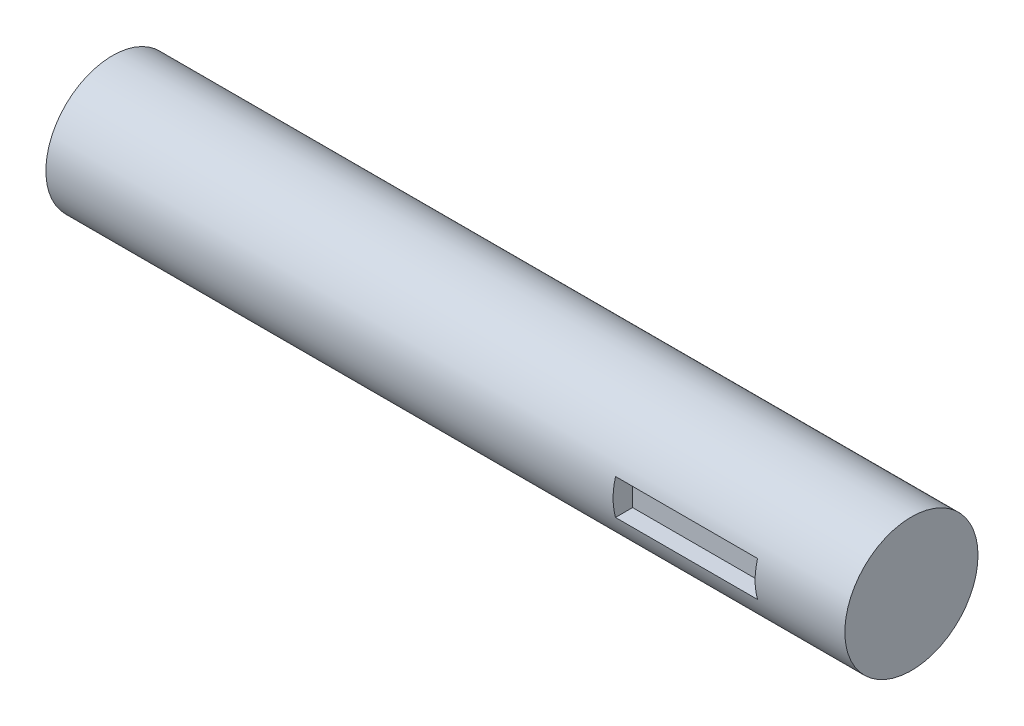
ISO-10303-21;
HEADER;
FILE_DESCRIPTION(('STEP AP214'),'2;1');
FILE_NAME('part.step','',(''),(''),'','','');
FILE_SCHEMA(('AUTOMOTIVE_DESIGN { 1 0 10303 214 1 1 1 1 }'));
ENDSEC;
DATA;
#1=APPLICATION_CONTEXT('core data for automotive mechanical design processes');
#2=APPLICATION_PROTOCOL_DEFINITION('international standard','automotive_design',2000,#1);
#3=PRODUCT_CONTEXT('',#1,'mechanical');
#4=PRODUCT('Part','Part','',(#3));
#5=PRODUCT_RELATED_PRODUCT_CATEGORY('part','',(#4));
#6=PRODUCT_DEFINITION_FORMATION('','',#4);
#7=PRODUCT_DEFINITION_CONTEXT('part definition',#1,'design');
#8=PRODUCT_DEFINITION('design','',#6,#7);
#9=PRODUCT_DEFINITION_SHAPE('','',#8);
#10=(LENGTH_UNIT() NAMED_UNIT(*) SI_UNIT(.MILLI.,.METRE.));
#11=(NAMED_UNIT(*) PLANE_ANGLE_UNIT() SI_UNIT($,.RADIAN.));
#12=(NAMED_UNIT(*) SI_UNIT($,.STERADIAN.) SOLID_ANGLE_UNIT());
#13=UNCERTAINTY_MEASURE_WITH_UNIT(LENGTH_MEASURE(1.E-05),#10,'distance_accuracy_value','');
#14=(GEOMETRIC_REPRESENTATION_CONTEXT(3) GLOBAL_UNCERTAINTY_ASSIGNED_CONTEXT((#13)) GLOBAL_UNIT_ASSIGNED_CONTEXT((#10,
#11,#12)) REPRESENTATION_CONTEXT('',''));
#15=CARTESIAN_POINT('',(0.,0.,0.));
#16=DIRECTION('',(0.,0.,1.));
#17=DIRECTION('',(1.,0.,0.));
#18=AXIS2_PLACEMENT_3D('',#15,#16,#17);
#19=CARTESIAN_POINT('',(0.,0.,0.));
#20=DIRECTION('',(-1.,0.,0.));
#21=DIRECTION('',(0.,0.,1.));
#22=AXIS2_PLACEMENT_3D('',#19,#20,#21);
#23=PLANE('',#22);
#24=CARTESIAN_POINT('',(0.,0.,0.));
#25=DIRECTION('',(1.,0.,0.));
#26=DIRECTION('',(0.,0.,-1.));
#27=AXIS2_PLACEMENT_3D('',#24,#25,#26);
#28=CIRCLE('',#27,15.);
#29=CARTESIAN_POINT('',(0.,0.,-15.));
#30=VERTEX_POINT('',#29);
#31=EDGE_CURVE('E106',#30,#30,#28,.T.);
#32=ORIENTED_EDGE('',*,*,#31,.F.);
#33=EDGE_LOOP('',(#32));
#34=FACE_BOUND('',#33,.T.);
#35=ADVANCED_FACE('F35',(#34),#23,.T.);
#36=CARTESIAN_POINT('',(0.,0.,0.));
#37=DIRECTION('',(1.,0.,0.));
#38=DIRECTION('',(0.,0.,-1.));
#39=AXIS2_PLACEMENT_3D('',#36,#37,#38);
#40=CYLINDRICAL_SURFACE('',#39,15.);
#41=CARTESIAN_POINT('',(159.78639181162,0.,0.));
#42=DIRECTION('',(1.,0.,0.));
#43=DIRECTION('',(0.,0.,-1.));
#44=AXIS2_PLACEMENT_3D('',#41,#42,#43);
#45=CIRCLE('',#44,15.);
#46=CARTESIAN_POINT('',(159.78639181162,-4.,14.456832294801));
#47=VERTEX_POINT('',#46);
#48=CARTESIAN_POINT('',(159.78639181162,4.,14.456832294801));
#49=VERTEX_POINT('',#48);
#50=EDGE_CURVE('E57',#47,#49,#45,.F.);
#51=ORIENTED_EDGE('',*,*,#50,.F.);
#52=DIRECTION('',(1.,0.,0.));
#53=VECTOR('',#52,1.);
#54=CARTESIAN_POINT('',(0.,-4.00000000000002,14.456832294801));
#55=LINE('',#54,#53);
#56=CARTESIAN_POINT('',(127.78639181162,-4.,14.456832294801));
#57=VERTEX_POINT('',#56);
#58=EDGE_CURVE('E11',#57,#47,#55,.T.);
#59=ORIENTED_EDGE('',*,*,#58,.F.);
#60=CARTESIAN_POINT('',(127.78639181162,0.,0.));
#61=DIRECTION('',(-1.,0.,0.));
#62=DIRECTION('',(0.,0.,1.));
#63=AXIS2_PLACEMENT_3D('',#60,#61,#62);
#64=CIRCLE('',#63,15.);
#65=CARTESIAN_POINT('',(127.78639181162,4.,14.456832294801));
#66=VERTEX_POINT('',#65);
#67=EDGE_CURVE('E109',#66,#57,#64,.F.);
#68=ORIENTED_EDGE('',*,*,#67,.F.);
#69=DIRECTION('',(1.,0.,0.));
#70=VECTOR('',#69,1.);
#71=CARTESIAN_POINT('',(0.,3.99999999999999,14.456832294801));
#72=LINE('',#71,#70);
#73=EDGE_CURVE('E42',#49,#66,#72,.F.);
#74=ORIENTED_EDGE('',*,*,#73,.F.);
#75=EDGE_LOOP('',(#51,#59,#68,#74));
#76=FACE_BOUND('',#75,.T.);
#77=ORIENTED_EDGE('',*,*,#31,.T.);
#78=EDGE_LOOP('',(#77));
#79=FACE_BOUND('',#78,.T.);
#80=CARTESIAN_POINT('',(180.,0.,0.));
#81=DIRECTION('',(1.,0.,0.));
#82=DIRECTION('',(0.,0.,-1.));
#83=AXIS2_PLACEMENT_3D('',#80,#81,#82);
#84=CIRCLE('',#83,15.);
#85=CARTESIAN_POINT('',(180.,0.,-15.));
#86=VERTEX_POINT('',#85);
#87=EDGE_CURVE('E100',#86,#86,#84,.T.);
#88=ORIENTED_EDGE('',*,*,#87,.F.);
#89=EDGE_LOOP('',(#88));
#90=FACE_BOUND('',#89,.T.);
#91=ADVANCED_FACE('F115',(#76,#79,#90),#40,.T.);
#92=CARTESIAN_POINT('',(180.,0.,0.));
#93=DIRECTION('',(1.,0.,0.));
#94=DIRECTION('',(0.,0.,-1.));
#95=AXIS2_PLACEMENT_3D('',#92,#93,#94);
#96=PLANE('',#95);
#97=ORIENTED_EDGE('',*,*,#87,.T.);
#98=EDGE_LOOP('',(#97));
#99=FACE_BOUND('',#98,.T.);
#100=ADVANCED_FACE('F118',(#99),#96,.T.);
#101=CARTESIAN_POINT('',(159.78639181162,4.,10.6));
#102=DIRECTION('',(0.,1.,0.));
#103=DIRECTION('',(-1.,0.,0.));
#104=AXIS2_PLACEMENT_3D('',#101,#102,#103);
#105=PLANE('',#104);
#106=ORIENTED_EDGE('',*,*,#73,.T.);
#107=DIRECTION('',(0.,0.,1.));
#108=VECTOR('',#107,1.);
#109=CARTESIAN_POINT('',(127.78639181162,4.,10.6));
#110=LINE('',#109,#108);
#111=CARTESIAN_POINT('',(127.78639181162,4.,10.6));
#112=VERTEX_POINT('',#111);
#113=EDGE_CURVE('E49',#112,#66,#110,.T.);
#114=ORIENTED_EDGE('',*,*,#113,.F.);
#115=DIRECTION('',(-1.,0.,0.));
#116=VECTOR('',#115,1.);
#117=CARTESIAN_POINT('',(159.78639181162,4.,10.6));
#118=LINE('',#117,#116);
#119=CARTESIAN_POINT('',(159.78639181162,4.,10.6));
#120=VERTEX_POINT('',#119);
#121=EDGE_CURVE('E76',#120,#112,#118,.T.);
#122=ORIENTED_EDGE('',*,*,#121,.F.);
#123=DIRECTION('',(0.,0.,1.));
#124=VECTOR('',#123,1.);
#125=CARTESIAN_POINT('',(159.78639181162,4.,10.6));
#126=LINE('',#125,#124);
#127=EDGE_CURVE('E98',#120,#49,#126,.T.);
#128=ORIENTED_EDGE('',*,*,#127,.T.);
#129=EDGE_LOOP('',(#106,#114,#122,#128));
#130=FACE_BOUND('',#129,.T.);
#131=ADVANCED_FACE('F74',(#130),#105,.F.);
#132=CARTESIAN_POINT('',(159.78639181162,-4.,10.6));
#133=DIRECTION('',(1.,0.,0.));
#134=DIRECTION('',(0.,0.,-1.));
#135=AXIS2_PLACEMENT_3D('',#132,#133,#134);
#136=PLANE('',#135);
#137=DIRECTION('',(0.,0.,1.));
#138=VECTOR('',#137,1.);
#139=CARTESIAN_POINT('',(159.78639181162,-4.,10.6));
#140=LINE('',#139,#138);
#141=CARTESIAN_POINT('',(159.78639181162,-4.,10.6));
#142=VERTEX_POINT('',#141);
#143=EDGE_CURVE('E101',#142,#47,#140,.T.);
#144=ORIENTED_EDGE('',*,*,#143,.T.);
#145=ORIENTED_EDGE('',*,*,#50,.T.);
#146=ORIENTED_EDGE('',*,*,#127,.F.);
#147=DIRECTION('',(0.,1.,0.));
#148=VECTOR('',#147,1.);
#149=CARTESIAN_POINT('',(159.78639181162,-4.,10.6));
#150=LINE('',#149,#148);
#151=EDGE_CURVE('E81',#142,#120,#150,.T.);
#152=ORIENTED_EDGE('',*,*,#151,.F.);
#153=EDGE_LOOP('',(#144,#145,#146,#152));
#154=FACE_BOUND('',#153,.T.);
#155=ADVANCED_FACE('F129',(#154),#136,.F.);
#156=CARTESIAN_POINT('',(159.78639181162,-4.,10.6));
#157=DIRECTION('',(0.,-1.,0.));
#158=DIRECTION('',(1.,0.,0.));
#159=AXIS2_PLACEMENT_3D('',#156,#157,#158);
#160=PLANE('',#159);
#161=ORIENTED_EDGE('',*,*,#58,.T.);
#162=ORIENTED_EDGE('',*,*,#143,.F.);
#163=DIRECTION('',(1.,0.,0.));
#164=VECTOR('',#163,1.);
#165=CARTESIAN_POINT('',(159.78639181162,-4.,10.6));
#166=LINE('',#165,#164);
#167=CARTESIAN_POINT('',(127.78639181162,-4.,10.6));
#168=VERTEX_POINT('',#167);
#169=EDGE_CURVE('E90',#168,#142,#166,.T.);
#170=ORIENTED_EDGE('',*,*,#169,.F.);
#171=DIRECTION('',(0.,0.,1.));
#172=VECTOR('',#171,1.);
#173=CARTESIAN_POINT('',(127.78639181162,-4.,10.6));
#174=LINE('',#173,#172);
#175=EDGE_CURVE('E80',#168,#57,#174,.T.);
#176=ORIENTED_EDGE('',*,*,#175,.T.);
#177=EDGE_LOOP('',(#161,#162,#170,#176));
#178=FACE_BOUND('',#177,.T.);
#179=ADVANCED_FACE('F114',(#178),#160,.F.);
#180=CARTESIAN_POINT('',(127.78639181162,4.,10.6));
#181=DIRECTION('',(-1.,0.,0.));
#182=DIRECTION('',(0.,0.,1.));
#183=AXIS2_PLACEMENT_3D('',#180,#181,#182);
#184=PLANE('',#183);
#185=ORIENTED_EDGE('',*,*,#67,.T.);
#186=ORIENTED_EDGE('',*,*,#175,.F.);
#187=DIRECTION('',(0.,-1.,0.));
#188=VECTOR('',#187,1.);
#189=CARTESIAN_POINT('',(127.78639181162,4.,10.6));
#190=LINE('',#189,#188);
#191=EDGE_CURVE('E84',#112,#168,#190,.T.);
#192=ORIENTED_EDGE('',*,*,#191,.F.);
#193=ORIENTED_EDGE('',*,*,#113,.T.);
#194=EDGE_LOOP('',(#185,#186,#192,#193));
#195=FACE_BOUND('',#194,.T.);
#196=ADVANCED_FACE('F85',(#195),#184,.F.);
#197=CARTESIAN_POINT('',(0.,0.,10.6));
#198=DIRECTION('',(0.,0.,1.));
#199=DIRECTION('',(1.,0.,0.));
#200=AXIS2_PLACEMENT_3D('',#197,#198,#199);
#201=PLANE('',#200);
#202=ORIENTED_EDGE('',*,*,#121,.T.);
#203=ORIENTED_EDGE('',*,*,#191,.T.);
#204=ORIENTED_EDGE('',*,*,#169,.T.);
#205=ORIENTED_EDGE('',*,*,#151,.T.);
#206=EDGE_LOOP('',(#202,#203,#204,#205));
#207=FACE_BOUND('',#206,.T.);
#208=ADVANCED_FACE('F92',(#207),#201,.T.);
#209=CLOSED_SHELL('',(#35,#91,#100,#131,#155,#179,#196,#208));
#210=MANIFOLD_SOLID_BREP('B2',#209);
#211=ADVANCED_BREP_SHAPE_REPRESENTATION('',(#18,#210),#14);
#212=SHAPE_DEFINITION_REPRESENTATION(#9,#211);
ENDSEC;
END-ISO-10303-21;
